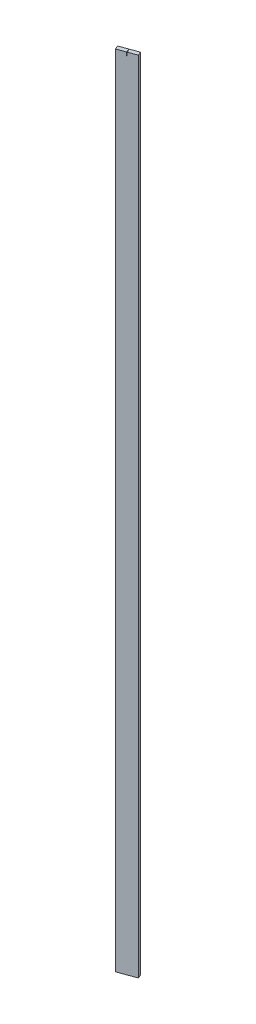
ISO-10303-21;
HEADER;
FILE_DESCRIPTION(('STEP AP214'),'2;1');
FILE_NAME('part.step','',(''),(''),'','','');
FILE_SCHEMA(('AUTOMOTIVE_DESIGN { 1 0 10303 214 1 1 1 1 }'));
ENDSEC;
DATA;
#1=APPLICATION_CONTEXT('core data for automotive mechanical design processes');
#2=APPLICATION_PROTOCOL_DEFINITION('international standard','automotive_design',2000,#1);
#3=PRODUCT_CONTEXT('',#1,'mechanical');
#4=PRODUCT('Part','Part','',(#3));
#5=PRODUCT_RELATED_PRODUCT_CATEGORY('part','',(#4));
#6=PRODUCT_DEFINITION_FORMATION('','',#4);
#7=PRODUCT_DEFINITION_CONTEXT('part definition',#1,'design');
#8=PRODUCT_DEFINITION('design','',#6,#7);
#9=PRODUCT_DEFINITION_SHAPE('','',#8);
#10=(LENGTH_UNIT() NAMED_UNIT(*) SI_UNIT(.MILLI.,.METRE.));
#11=(NAMED_UNIT(*) PLANE_ANGLE_UNIT() SI_UNIT($,.RADIAN.));
#12=(NAMED_UNIT(*) SI_UNIT($,.STERADIAN.) SOLID_ANGLE_UNIT());
#13=UNCERTAINTY_MEASURE_WITH_UNIT(LENGTH_MEASURE(1.E-05),#10,'distance_accuracy_value','');
#14=(GEOMETRIC_REPRESENTATION_CONTEXT(3) GLOBAL_UNCERTAINTY_ASSIGNED_CONTEXT((#13)) GLOBAL_UNIT_ASSIGNED_CONTEXT((#10,
#11,#12)) REPRESENTATION_CONTEXT('',''));
#15=CARTESIAN_POINT('',(0.,0.,0.));
#16=DIRECTION('',(0.,0.,1.));
#17=DIRECTION('',(1.,0.,0.));
#18=AXIS2_PLACEMENT_3D('',#15,#16,#17);
#19=CARTESIAN_POINT('',(975.24959310475,56.2685396052182,2504.22731764613));
#20=DIRECTION('',(0.,1.,0.));
#21=DIRECTION('',(-1.,0.,0.));
#22=AXIS2_PLACEMENT_3D('',#19,#20,#21);
#23=PLANE('',#22);
#24=DIRECTION('',(0.939692620785908,0.,-0.342020143325669));
#25=VECTOR('',#24,1.);
#26=CARTESIAN_POINT('',(971.829391671493,56.2685396052182,2494.83039143827));
#27=LINE('',#26,#25);
#28=CARTESIAN_POINT('',(993.34835268749,56.2685396052182,2486.99813015611));
#29=VERTEX_POINT('',#28);
#30=CARTESIAN_POINT('',(1013.9276210827,56.2685396052182,2479.50788901728));
#31=VERTEX_POINT('',#30);
#32=EDGE_CURVE('E147',#29,#31,#27,.T.);
#33=ORIENTED_EDGE('',*,*,#32,.F.);
#34=DIRECTION('',(0.342020143325669,0.,0.939692620785908));
#35=VECTOR('',#34,1.);
#36=CARTESIAN_POINT('',(77.8428774835953,56.268539605218,-28.3324903536595));
#37=LINE('',#36,#35);
#38=CARTESIAN_POINT('',(996.768554120747,56.2685396052182,2496.39505636397));
#39=VERTEX_POINT('',#38);
#40=EDGE_CURVE('E123',#29,#39,#37,.T.);
#41=ORIENTED_EDGE('',*,*,#40,.T.);
#42=DIRECTION('',(0.939692620785908,0.,-0.342020143325669));
#43=VECTOR('',#42,1.);
#44=CARTESIAN_POINT('',(975.24959310475,56.2685396052182,2504.22731764613));
#45=LINE('',#44,#43);
#46=CARTESIAN_POINT('',(1017.34782251596,56.2685396052182,2488.90481522514));
#47=VERTEX_POINT('',#46);
#48=EDGE_CURVE('E84',#39,#47,#45,.T.);
#49=ORIENTED_EDGE('',*,*,#48,.T.);
#50=DIRECTION('',(-0.342020143325666,0.,-0.939692620785909));
#51=VECTOR('',#50,1.);
#52=CARTESIAN_POINT('',(1017.34782251596,56.2685396052182,2488.90481522514));
#53=LINE('',#52,#51);
#54=EDGE_CURVE('E37',#47,#31,#53,.T.);
#55=ORIENTED_EDGE('',*,*,#54,.T.);
#56=EDGE_LOOP('',(#33,#41,#49,#55));
#57=FACE_BOUND('',#56,.T.);
#58=ADVANCED_FACE('F33',(#57),#23,.T.);
#59=CARTESIAN_POINT('',(918.925676637151,4.57429179625063E-13,2524.72754671763));
#60=DIRECTION('',(-0.342020143325669,0.,-0.939692620785908));
#61=DIRECTION('',(-0.939692620785908,0.,0.342020143325669));
#62=AXIS2_PLACEMENT_3D('',#59,#60,#61);
#63=PLANE('',#62);
#64=DIRECTION('',(0.,1.,0.));
#65=VECTOR('',#64,1.);
#66=CARTESIAN_POINT('',(996.768554120747,47.3085396052182,2496.39505636397));
#67=LINE('',#66,#65);
#68=CARTESIAN_POINT('',(996.768554120747,47.3085396052182,2496.39505636397));
#69=VERTEX_POINT('',#68);
#70=EDGE_CURVE('E130',#69,#39,#67,.T.);
#71=ORIENTED_EDGE('',*,*,#70,.F.);
#72=DIRECTION('',(0.939692620785908,0.,-0.342020143325669));
#73=VECTOR('',#72,1.);
#74=CARTESIAN_POINT('',(918.925676637151,47.3085396052181,2524.72754671763));
#75=LINE('',#74,#73);
#76=CARTESIAN_POINT('',(995.828861499961,47.3085396052182,2496.7370765073));
#77=VERTEX_POINT('',#76);
#78=EDGE_CURVE('E116',#77,#69,#75,.T.);
#79=ORIENTED_EDGE('',*,*,#78,.F.);
#80=DIRECTION('',(0.,1.,0.));
#81=VECTOR('',#80,1.);
#82=CARTESIAN_POINT('',(995.828861499961,47.3085396052182,2496.7370765073));
#83=LINE('',#82,#81);
#84=CARTESIAN_POINT('',(995.828861499961,56.2685396052182,2496.7370765073));
#85=VERTEX_POINT('',#84);
#86=EDGE_CURVE('E114',#77,#85,#83,.T.);
#87=ORIENTED_EDGE('',*,*,#86,.T.);
#88=CARTESIAN_POINT('',(975.24959310475,56.2685396052182,2504.22731764613));
#89=VERTEX_POINT('',#88);
#90=EDGE_CURVE('E135',#89,#85,#45,.T.);
#91=ORIENTED_EDGE('',*,*,#90,.F.);
#92=DIRECTION('',(0.,1.,0.));
#93=VECTOR('',#92,1.);
#94=CARTESIAN_POINT('',(975.24959310475,-1943.73146039478,2504.22731764613));
#95=LINE('',#94,#93);
#96=CARTESIAN_POINT('',(975.24959310475,-1943.73146039478,2504.22731764613));
#97=VERTEX_POINT('',#96);
#98=EDGE_CURVE('E143',#97,#89,#95,.T.);
#99=ORIENTED_EDGE('',*,*,#98,.F.);
#100=DIRECTION('',(-0.939692620785911,0.,0.342020143325661));
#101=VECTOR('',#100,1.);
#102=CARTESIAN_POINT('',(1017.34782251596,-1943.73146039478,2488.90481522514));
#103=LINE('',#102,#101);
#104=CARTESIAN_POINT('',(1017.34782251596,-1943.73146039478,2488.90481522514));
#105=VERTEX_POINT('',#104);
#106=EDGE_CURVE('E140',#105,#97,#103,.T.);
#107=ORIENTED_EDGE('',*,*,#106,.F.);
#108=DIRECTION('',(0.,-1.,0.));
#109=VECTOR('',#108,1.);
#110=CARTESIAN_POINT('',(1017.34782251596,56.2685396052182,2488.90481522514));
#111=LINE('',#110,#109);
#112=EDGE_CURVE('E137',#47,#105,#111,.T.);
#113=ORIENTED_EDGE('',*,*,#112,.F.);
#114=ORIENTED_EDGE('',*,*,#48,.F.);
#115=EDGE_LOOP('',(#71,#79,#87,#91,#99,#107,#113,#114));
#116=FACE_BOUND('',#115,.T.);
#117=ADVANCED_FACE('F170',(#116),#63,.F.);
#118=CARTESIAN_POINT('',(915.505475203894,4.56874068112751E-13,2515.33062050977));
#119=DIRECTION('',(-0.342020143325669,0.,-0.939692620785908));
#120=DIRECTION('',(-0.939692620785908,0.,0.342020143325669));
#121=AXIS2_PLACEMENT_3D('',#118,#119,#120);
#122=PLANE('',#121);
#123=DIRECTION('',(-0.939692620785908,0.,0.342020143325669));
#124=VECTOR('',#123,1.);
#125=CARTESIAN_POINT('',(915.505475203894,47.3085396052181,2515.33062050977));
#126=LINE('',#125,#124);
#127=CARTESIAN_POINT('',(993.34835268749,47.3085396052182,2486.99813015611));
#128=VERTEX_POINT('',#127);
#129=CARTESIAN_POINT('',(992.408660066704,47.3085396052182,2487.34015029944));
#130=VERTEX_POINT('',#129);
#131=EDGE_CURVE('E117',#128,#130,#126,.T.);
#132=ORIENTED_EDGE('',*,*,#131,.F.);
#133=DIRECTION('',(0.,1.,0.));
#134=VECTOR('',#133,1.);
#135=CARTESIAN_POINT('',(993.34835268749,47.3085396052182,2486.99813015611));
#136=LINE('',#135,#134);
#137=EDGE_CURVE('E162',#128,#29,#136,.T.);
#138=ORIENTED_EDGE('',*,*,#137,.T.);
#139=ORIENTED_EDGE('',*,*,#32,.T.);
#140=DIRECTION('',(0.,-1.,0.));
#141=VECTOR('',#140,1.);
#142=CARTESIAN_POINT('',(1013.9276210827,56.2685396052182,2479.50788901728));
#143=LINE('',#142,#141);
#144=CARTESIAN_POINT('',(1013.9276210827,-1943.73146039478,2479.50788901728));
#145=VERTEX_POINT('',#144);
#146=EDGE_CURVE('E146',#31,#145,#143,.T.);
#147=ORIENTED_EDGE('',*,*,#146,.T.);
#148=DIRECTION('',(-0.939692620785911,0.,0.342020143325661));
#149=VECTOR('',#148,1.);
#150=CARTESIAN_POINT('',(1013.9276210827,-1943.73146039478,2479.50788901728));
#151=LINE('',#150,#149);
#152=CARTESIAN_POINT('',(971.829391671493,-1943.73146039478,2494.83039143827));
#153=VERTEX_POINT('',#152);
#154=EDGE_CURVE('E150',#145,#153,#151,.T.);
#155=ORIENTED_EDGE('',*,*,#154,.T.);
#156=DIRECTION('',(0.,1.,0.));
#157=VECTOR('',#156,1.);
#158=CARTESIAN_POINT('',(971.829391671493,-1943.73146039478,2494.83039143827));
#159=LINE('',#158,#157);
#160=CARTESIAN_POINT('',(971.829391671493,56.2685396052182,2494.83039143827));
#161=VERTEX_POINT('',#160);
#162=EDGE_CURVE('E153',#153,#161,#159,.T.);
#163=ORIENTED_EDGE('',*,*,#162,.T.);
#164=CARTESIAN_POINT('',(992.408660066704,56.2685396052182,2487.34015029944));
#165=VERTEX_POINT('',#164);
#166=EDGE_CURVE('E128',#161,#165,#27,.T.);
#167=ORIENTED_EDGE('',*,*,#166,.T.);
#168=DIRECTION('',(0.,1.,0.));
#169=VECTOR('',#168,1.);
#170=CARTESIAN_POINT('',(992.408660066704,47.3085396052182,2487.34015029944));
#171=LINE('',#170,#169);
#172=EDGE_CURVE('E111',#130,#165,#171,.T.);
#173=ORIENTED_EDGE('',*,*,#172,.F.);
#174=EDGE_LOOP('',(#132,#138,#139,#147,#155,#163,#167,#173));
#175=FACE_BOUND('',#174,.T.);
#176=ADVANCED_FACE('F126',(#175),#122,.T.);
#177=DIRECTION('',(0.342020143325687,0.,0.939692620785902));
#178=VECTOR('',#177,1.);
#179=CARTESIAN_POINT('',(76.903184862759,56.268539605218,-27.9904702103172));
#180=LINE('',#179,#178);
#181=EDGE_CURVE('E166',#165,#85,#180,.T.);
#182=ORIENTED_EDGE('',*,*,#181,.F.);
#183=ORIENTED_EDGE('',*,*,#166,.F.);
#184=DIRECTION('',(-0.342020143325666,0.,-0.939692620785909));
#185=VECTOR('',#184,1.);
#186=CARTESIAN_POINT('',(975.24959310475,56.2685396052182,2504.22731764613));
#187=LINE('',#186,#185);
#188=EDGE_CURVE('E11',#89,#161,#187,.T.);
#189=ORIENTED_EDGE('',*,*,#188,.F.);
#190=ORIENTED_EDGE('',*,*,#90,.T.);
#191=EDGE_LOOP('',(#182,#183,#189,#190));
#192=FACE_BOUND('',#191,.T.);
#193=ADVANCED_FACE('F35',(#192),#23,.T.);
#194=CARTESIAN_POINT('',(975.24959310475,-1943.73146039478,2504.22731764613));
#195=DIRECTION('',(-0.939692620785909,0.,0.342020143325666));
#196=DIRECTION('',(0.342020143325666,0.,0.939692620785909));
#197=AXIS2_PLACEMENT_3D('',#194,#195,#196);
#198=PLANE('',#197);
#199=ORIENTED_EDGE('',*,*,#188,.T.);
#200=ORIENTED_EDGE('',*,*,#162,.F.);
#201=DIRECTION('',(-0.342020143325666,0.,-0.939692620785909));
#202=VECTOR('',#201,1.);
#203=CARTESIAN_POINT('',(975.24959310475,-1943.73146039478,2504.22731764613));
#204=LINE('',#203,#202);
#205=EDGE_CURVE('E42',#97,#153,#204,.T.);
#206=ORIENTED_EDGE('',*,*,#205,.F.);
#207=ORIENTED_EDGE('',*,*,#98,.T.);
#208=EDGE_LOOP('',(#199,#200,#206,#207));
#209=FACE_BOUND('',#208,.T.);
#210=ADVANCED_FACE('F191',(#209),#198,.T.);
#211=CARTESIAN_POINT('',(1017.34782251596,56.2685396052182,2488.90481522514));
#212=DIRECTION('',(0.939692620785909,0.,-0.342020143325666));
#213=DIRECTION('',(-0.342020143325666,0.,-0.939692620785909));
#214=AXIS2_PLACEMENT_3D('',#211,#212,#213);
#215=PLANE('',#214);
#216=ORIENTED_EDGE('',*,*,#146,.F.);
#217=ORIENTED_EDGE('',*,*,#54,.F.);
#218=ORIENTED_EDGE('',*,*,#112,.T.);
#219=DIRECTION('',(-0.342020143325666,0.,-0.939692620785909));
#220=VECTOR('',#219,1.);
#221=CARTESIAN_POINT('',(1017.34782251596,-1943.73146039478,2488.90481522514));
#222=LINE('',#221,#220);
#223=EDGE_CURVE('E155',#105,#145,#222,.T.);
#224=ORIENTED_EDGE('',*,*,#223,.T.);
#225=EDGE_LOOP('',(#216,#217,#218,#224));
#226=FACE_BOUND('',#225,.T.);
#227=ADVANCED_FACE('F161',(#226),#215,.T.);
#228=CARTESIAN_POINT('',(1017.34782251596,-1943.73146039478,2488.90481522514));
#229=DIRECTION('',(0.,-1.,0.));
#230=DIRECTION('',(0.,0.,-1.));
#231=AXIS2_PLACEMENT_3D('',#228,#229,#230);
#232=PLANE('',#231);
#233=ORIENTED_EDGE('',*,*,#154,.F.);
#234=ORIENTED_EDGE('',*,*,#223,.F.);
#235=ORIENTED_EDGE('',*,*,#106,.T.);
#236=ORIENTED_EDGE('',*,*,#205,.T.);
#237=EDGE_LOOP('',(#233,#234,#235,#236));
#238=FACE_BOUND('',#237,.T.);
#239=ADVANCED_FACE('F174',(#238),#232,.T.);
#240=CARTESIAN_POINT('',(77.8428774835953,47.308539605218,-28.3324903536595));
#241=DIRECTION('',(-0.939692620785908,0.,0.342020143325669));
#242=DIRECTION('',(0.342020143325669,0.,0.939692620785909));
#243=AXIS2_PLACEMENT_3D('',#240,#241,#242);
#244=PLANE('',#243);
#245=ORIENTED_EDGE('',*,*,#40,.F.);
#246=ORIENTED_EDGE('',*,*,#137,.F.);
#247=DIRECTION('',(0.342020143325669,0.,0.939692620785908));
#248=VECTOR('',#247,1.);
#249=CARTESIAN_POINT('',(77.8428774835953,47.308539605218,-28.3324903536595));
#250=LINE('',#249,#248);
#251=EDGE_CURVE('E50',#128,#69,#250,.T.);
#252=ORIENTED_EDGE('',*,*,#251,.T.);
#253=ORIENTED_EDGE('',*,*,#70,.T.);
#254=EDGE_LOOP('',(#245,#246,#252,#253));
#255=FACE_BOUND('',#254,.T.);
#256=ADVANCED_FACE('F172',(#255),#244,.T.);
#257=CARTESIAN_POINT('',(76.903184862759,47.308539605218,-27.9904702103172));
#258=DIRECTION('',(-0.939692620785902,0.,0.342020143325687));
#259=DIRECTION('',(0.342020143325687,0.,0.939692620785902));
#260=AXIS2_PLACEMENT_3D('',#257,#258,#259);
#261=PLANE('',#260);
#262=ORIENTED_EDGE('',*,*,#181,.T.);
#263=ORIENTED_EDGE('',*,*,#86,.F.);
#264=DIRECTION('',(0.342020143325687,0.,0.939692620785902));
#265=VECTOR('',#264,1.);
#266=CARTESIAN_POINT('',(76.903184862759,47.308539605218,-27.9904702103172));
#267=LINE('',#266,#265);
#268=EDGE_CURVE('E108',#130,#77,#267,.T.);
#269=ORIENTED_EDGE('',*,*,#268,.F.);
#270=ORIENTED_EDGE('',*,*,#172,.T.);
#271=EDGE_LOOP('',(#262,#263,#269,#270));
#272=FACE_BOUND('',#271,.T.);
#273=ADVANCED_FACE('F109',(#272),#261,.F.);
#274=CARTESIAN_POINT('',(0.,47.308539605218,0.));
#275=DIRECTION('',(0.,1.,0.));
#276=DIRECTION('',(-1.,0.,0.));
#277=AXIS2_PLACEMENT_3D('',#274,#275,#276);
#278=PLANE('',#277);
#279=ORIENTED_EDGE('',*,*,#131,.T.);
#280=ORIENTED_EDGE('',*,*,#268,.T.);
#281=ORIENTED_EDGE('',*,*,#78,.T.);
#282=ORIENTED_EDGE('',*,*,#251,.F.);
#283=EDGE_LOOP('',(#279,#280,#281,#282));
#284=FACE_BOUND('',#283,.T.);
#285=ADVANCED_FACE('F120',(#284),#278,.T.);
#286=CLOSED_SHELL('',(#58,#117,#176,#193,#210,#227,#239,#256,#273,#285));
#287=MANIFOLD_SOLID_BREP('B2',#286);
#288=ADVANCED_BREP_SHAPE_REPRESENTATION('',(#18,#287),#14);
#289=SHAPE_DEFINITION_REPRESENTATION(#9,#288);
ENDSEC;
END-ISO-10303-21;
